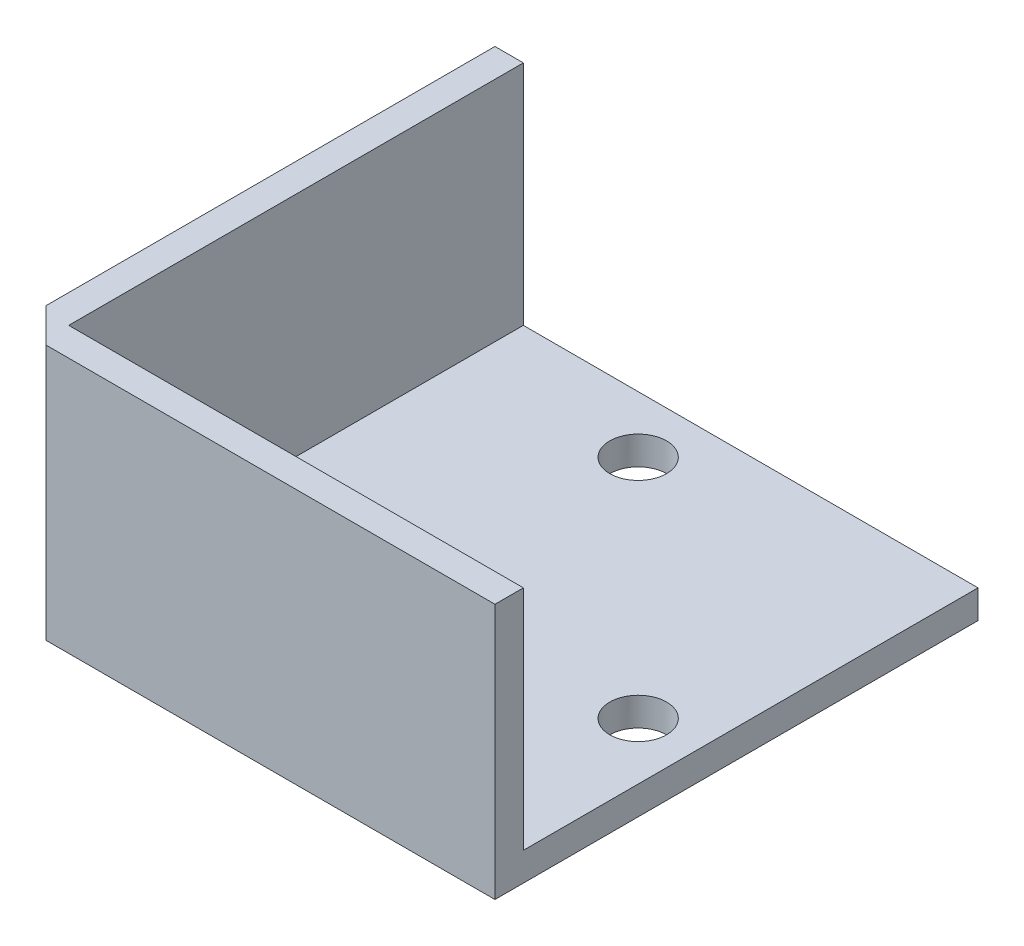
ISO-10303-21;
HEADER;
FILE_DESCRIPTION(('STEP AP214'),'2;1');
FILE_NAME('part.step','',(''),(''),'','','');
FILE_SCHEMA(('AUTOMOTIVE_DESIGN { 1 0 10303 214 1 1 1 1 }'));
ENDSEC;
DATA;
#1=APPLICATION_CONTEXT('core data for automotive mechanical design processes');
#2=APPLICATION_PROTOCOL_DEFINITION('international standard','automotive_design',2000,#1);
#3=PRODUCT_CONTEXT('',#1,'mechanical');
#4=PRODUCT('Part','Part','',(#3));
#5=PRODUCT_RELATED_PRODUCT_CATEGORY('part','',(#4));
#6=PRODUCT_DEFINITION_FORMATION('','',#4);
#7=PRODUCT_DEFINITION_CONTEXT('part definition',#1,'design');
#8=PRODUCT_DEFINITION('design','',#6,#7);
#9=PRODUCT_DEFINITION_SHAPE('','',#8);
#10=(LENGTH_UNIT() NAMED_UNIT(*) SI_UNIT(.MILLI.,.METRE.));
#11=(NAMED_UNIT(*) PLANE_ANGLE_UNIT() SI_UNIT($,.RADIAN.));
#12=(NAMED_UNIT(*) SI_UNIT($,.STERADIAN.) SOLID_ANGLE_UNIT());
#13=UNCERTAINTY_MEASURE_WITH_UNIT(LENGTH_MEASURE(1.E-05),#10,'distance_accuracy_value','');
#14=(GEOMETRIC_REPRESENTATION_CONTEXT(3) GLOBAL_UNCERTAINTY_ASSIGNED_CONTEXT((#13)) GLOBAL_UNIT_ASSIGNED_CONTEXT((#10,
#11,#12)) REPRESENTATION_CONTEXT('',''));
#15=CARTESIAN_POINT('',(0.,0.,0.));
#16=DIRECTION('',(0.,0.,1.));
#17=DIRECTION('',(1.,0.,0.));
#18=AXIS2_PLACEMENT_3D('',#15,#16,#17);
#19=CARTESIAN_POINT('',(0.,3.175,0.));
#20=DIRECTION('',(1.,0.,0.));
#21=DIRECTION('',(0.,0.,-1.));
#22=AXIS2_PLACEMENT_3D('',#19,#20,#21);
#23=PLANE('',#22);
#24=DIRECTION('',(0.,0.,1.));
#25=VECTOR('',#24,1.);
#26=CARTESIAN_POINT('',(0.,0.,0.));
#27=LINE('',#26,#25);
#28=CARTESIAN_POINT('',(0.,0.,-53.975));
#29=VERTEX_POINT('',#28);
#30=CARTESIAN_POINT('',(0.,0.,-3.81000000000001));
#31=VERTEX_POINT('',#30);
#32=EDGE_CURVE('E150',#29,#31,#27,.T.);
#33=ORIENTED_EDGE('',*,*,#32,.T.);
#34=DIRECTION('',(0.,1.,0.));
#35=VECTOR('',#34,1.);
#36=CARTESIAN_POINT('',(0.,3.175,-3.81000000000001));
#37=LINE('',#36,#35);
#38=CARTESIAN_POINT('',(0.,28.575,-3.81000000000001));
#39=VERTEX_POINT('',#38);
#40=EDGE_CURVE('E44',#31,#39,#37,.T.);
#41=ORIENTED_EDGE('',*,*,#40,.T.);
#42=DIRECTION('',(0.,0.,1.));
#43=VECTOR('',#42,1.);
#44=CARTESIAN_POINT('',(0.,28.575,0.));
#45=LINE('',#44,#43);
#46=CARTESIAN_POINT('',(0.,28.575,-53.975));
#47=VERTEX_POINT('',#46);
#48=EDGE_CURVE('E112',#47,#39,#45,.T.);
#49=ORIENTED_EDGE('',*,*,#48,.F.);
#50=DIRECTION('',(0.,-1.,0.));
#51=VECTOR('',#50,1.);
#52=CARTESIAN_POINT('',(0.,3.175,-53.975));
#53=LINE('',#52,#51);
#54=EDGE_CURVE('E157',#47,#29,#53,.T.);
#55=ORIENTED_EDGE('',*,*,#54,.T.);
#56=EDGE_LOOP('',(#33,#41,#49,#55));
#57=FACE_BOUND('',#56,.T.);
#58=ADVANCED_FACE('F35',(#57),#23,.F.);
#59=CARTESIAN_POINT('',(0.,3.175,0.));
#60=DIRECTION('',(0.,0.,-1.));
#61=DIRECTION('',(-1.,0.,0.));
#62=AXIS2_PLACEMENT_3D('',#59,#60,#61);
#63=PLANE('',#62);
#64=DIRECTION('',(1.,0.,0.));
#65=VECTOR('',#64,1.);
#66=CARTESIAN_POINT('',(0.,28.575,0.));
#67=LINE('',#66,#65);
#68=CARTESIAN_POINT('',(3.80999999999999,28.575,0.));
#69=VERTEX_POINT('',#68);
#70=CARTESIAN_POINT('',(53.975,28.575,0.));
#71=VERTEX_POINT('',#70);
#72=EDGE_CURVE('E101',#69,#71,#67,.T.);
#73=ORIENTED_EDGE('',*,*,#72,.F.);
#74=DIRECTION('',(0.,-1.,0.));
#75=VECTOR('',#74,1.);
#76=CARTESIAN_POINT('',(3.80999999999999,3.175,0.));
#77=LINE('',#76,#75);
#78=CARTESIAN_POINT('',(3.80999999999999,0.,0.));
#79=VERTEX_POINT('',#78);
#80=EDGE_CURVE('E120',#69,#79,#77,.T.);
#81=ORIENTED_EDGE('',*,*,#80,.T.);
#82=DIRECTION('',(1.,0.,0.));
#83=VECTOR('',#82,1.);
#84=CARTESIAN_POINT('',(0.,0.,0.));
#85=LINE('',#84,#83);
#86=CARTESIAN_POINT('',(53.975,0.,0.));
#87=VERTEX_POINT('',#86);
#88=EDGE_CURVE('E117',#79,#87,#85,.T.);
#89=ORIENTED_EDGE('',*,*,#88,.T.);
#90=DIRECTION('',(0.,-1.,0.));
#91=VECTOR('',#90,1.);
#92=CARTESIAN_POINT('',(53.975,3.175,0.));
#93=LINE('',#92,#91);
#94=EDGE_CURVE('E115',#71,#87,#93,.T.);
#95=ORIENTED_EDGE('',*,*,#94,.F.);
#96=EDGE_LOOP('',(#73,#81,#89,#95));
#97=FACE_BOUND('',#96,.T.);
#98=ADVANCED_FACE('F116',(#97),#63,.F.);
#99=CARTESIAN_POINT('',(53.975,3.175,0.));
#100=DIRECTION('',(-1.,0.,0.));
#101=DIRECTION('',(0.,0.,1.));
#102=AXIS2_PLACEMENT_3D('',#99,#100,#101);
#103=PLANE('',#102);
#104=DIRECTION('',(0.,0.,-1.));
#105=VECTOR('',#104,1.);
#106=CARTESIAN_POINT('',(53.975,0.,0.));
#107=LINE('',#106,#105);
#108=CARTESIAN_POINT('',(53.975,0.,-53.975));
#109=VERTEX_POINT('',#108);
#110=EDGE_CURVE('E160',#87,#109,#107,.T.);
#111=ORIENTED_EDGE('',*,*,#110,.T.);
#112=DIRECTION('',(0.,-1.,0.));
#113=VECTOR('',#112,1.);
#114=CARTESIAN_POINT('',(53.975,3.175,-53.975));
#115=LINE('',#114,#113);
#116=CARTESIAN_POINT('',(53.975,3.175,-53.975));
#117=VERTEX_POINT('',#116);
#118=EDGE_CURVE('E121',#117,#109,#115,.T.);
#119=ORIENTED_EDGE('',*,*,#118,.F.);
#120=DIRECTION('',(0.,0.,-1.));
#121=VECTOR('',#120,1.);
#122=CARTESIAN_POINT('',(53.975,3.175,0.));
#123=LINE('',#122,#121);
#124=CARTESIAN_POINT('',(53.975,3.175,-3.175));
#125=VERTEX_POINT('',#124);
#126=EDGE_CURVE('E151',#125,#117,#123,.T.);
#127=ORIENTED_EDGE('',*,*,#126,.F.);
#128=DIRECTION('',(0.,-1.,0.));
#129=VECTOR('',#128,1.);
#130=CARTESIAN_POINT('',(53.975,28.575,-3.175));
#131=LINE('',#130,#129);
#132=CARTESIAN_POINT('',(53.975,28.575,-3.175));
#133=VERTEX_POINT('',#132);
#134=EDGE_CURVE('E125',#133,#125,#131,.T.);
#135=ORIENTED_EDGE('',*,*,#134,.F.);
#136=DIRECTION('',(0.,0.,-1.));
#137=VECTOR('',#136,1.);
#138=CARTESIAN_POINT('',(53.975,28.575,0.));
#139=LINE('',#138,#137);
#140=EDGE_CURVE('E106',#71,#133,#139,.T.);
#141=ORIENTED_EDGE('',*,*,#140,.F.);
#142=ORIENTED_EDGE('',*,*,#94,.T.);
#143=EDGE_LOOP('',(#111,#119,#127,#135,#141,#142));
#144=FACE_BOUND('',#143,.T.);
#145=ADVANCED_FACE('F123',(#144),#103,.F.);
#146=CARTESIAN_POINT('',(0.,3.175,-53.975));
#147=DIRECTION('',(0.,0.,1.));
#148=DIRECTION('',(1.,0.,0.));
#149=AXIS2_PLACEMENT_3D('',#146,#147,#148);
#150=PLANE('',#149);
#151=DIRECTION('',(-1.,0.,0.));
#152=VECTOR('',#151,1.);
#153=CARTESIAN_POINT('',(0.,0.,-53.975));
#154=LINE('',#153,#152);
#155=EDGE_CURVE('E154',#109,#29,#154,.T.);
#156=ORIENTED_EDGE('',*,*,#155,.T.);
#157=ORIENTED_EDGE('',*,*,#54,.F.);
#158=DIRECTION('',(-1.,0.,0.));
#159=VECTOR('',#158,1.);
#160=CARTESIAN_POINT('',(0.,28.575,-53.975));
#161=LINE('',#160,#159);
#162=CARTESIAN_POINT('',(3.175,28.575,-53.975));
#163=VERTEX_POINT('',#162);
#164=EDGE_CURVE('E135',#163,#47,#161,.T.);
#165=ORIENTED_EDGE('',*,*,#164,.F.);
#166=DIRECTION('',(0.,-1.,0.));
#167=VECTOR('',#166,1.);
#168=CARTESIAN_POINT('',(3.175,28.575,-53.975));
#169=LINE('',#168,#167);
#170=CARTESIAN_POINT('',(3.175,3.175,-53.975));
#171=VERTEX_POINT('',#170);
#172=EDGE_CURVE('E138',#163,#171,#169,.T.);
#173=ORIENTED_EDGE('',*,*,#172,.T.);
#174=DIRECTION('',(-1.,0.,0.));
#175=VECTOR('',#174,1.);
#176=CARTESIAN_POINT('',(0.,3.175,-53.975));
#177=LINE('',#176,#175);
#178=EDGE_CURVE('E153',#117,#171,#177,.T.);
#179=ORIENTED_EDGE('',*,*,#178,.F.);
#180=ORIENTED_EDGE('',*,*,#118,.T.);
#181=EDGE_LOOP('',(#156,#157,#165,#173,#179,#180));
#182=FACE_BOUND('',#181,.T.);
#183=ADVANCED_FACE('F188',(#182),#150,.F.);
#184=CARTESIAN_POINT('',(0.,3.175,0.));
#185=DIRECTION('',(0.,-1.,0.));
#186=DIRECTION('',(0.,0.,-1.));
#187=AXIS2_PLACEMENT_3D('',#184,#185,#186);
#188=PLANE('',#187);
#189=CARTESIAN_POINT('',(47.625,3.175,-22.352));
#190=DIRECTION('',(0.,1.,0.));
#191=DIRECTION('',(0.,0.,1.));
#192=AXIS2_PLACEMENT_3D('',#189,#190,#191);
#193=CIRCLE('',#192,3.175);
#194=CARTESIAN_POINT('',(47.625,3.175,-19.177));
#195=VERTEX_POINT('',#194);
#196=EDGE_CURVE('E178',#195,#195,#193,.T.);
#197=ORIENTED_EDGE('',*,*,#196,.F.);
#198=EDGE_LOOP('',(#197));
#199=FACE_BOUND('',#198,.T.);
#200=CARTESIAN_POINT('',(22.352,3.175,-47.625));
#201=DIRECTION('',(0.,1.,0.));
#202=DIRECTION('',(0.,0.,1.));
#203=AXIS2_PLACEMENT_3D('',#200,#201,#202);
#204=CIRCLE('',#203,3.175);
#205=CARTESIAN_POINT('',(22.352,3.175,-44.45));
#206=VERTEX_POINT('',#205);
#207=EDGE_CURVE('E170',#206,#206,#204,.T.);
#208=ORIENTED_EDGE('',*,*,#207,.F.);
#209=EDGE_LOOP('',(#208));
#210=FACE_BOUND('',#209,.T.);
#211=ORIENTED_EDGE('',*,*,#178,.T.);
#212=DIRECTION('',(0.,0.,1.));
#213=VECTOR('',#212,1.);
#214=CARTESIAN_POINT('',(3.17500000000001,3.175,0.));
#215=LINE('',#214,#213);
#216=CARTESIAN_POINT('',(3.17500000000001,3.175,-3.175));
#217=VERTEX_POINT('',#216);
#218=EDGE_CURVE('E142',#171,#217,#215,.T.);
#219=ORIENTED_EDGE('',*,*,#218,.T.);
#220=DIRECTION('',(1.,0.,0.));
#221=VECTOR('',#220,1.);
#222=CARTESIAN_POINT('',(0.,3.175,-3.175));
#223=LINE('',#222,#221);
#224=EDGE_CURVE('E139',#217,#125,#223,.T.);
#225=ORIENTED_EDGE('',*,*,#224,.T.);
#226=ORIENTED_EDGE('',*,*,#126,.T.);
#227=EDGE_LOOP('',(#211,#219,#225,#226));
#228=FACE_BOUND('',#227,.T.);
#229=ADVANCED_FACE('F191',(#199,#210,#228),#188,.F.);
#230=CARTESIAN_POINT('',(0.,0.,0.));
#231=DIRECTION('',(0.,-1.,0.));
#232=DIRECTION('',(0.,0.,-1.));
#233=AXIS2_PLACEMENT_3D('',#230,#231,#232);
#234=PLANE('',#233);
#235=CARTESIAN_POINT('',(47.625,0.,-22.352));
#236=DIRECTION('',(0.,-1.,0.));
#237=DIRECTION('',(0.,0.,-1.));
#238=AXIS2_PLACEMENT_3D('',#235,#236,#237);
#239=CIRCLE('',#238,3.175);
#240=CARTESIAN_POINT('',(47.625,0.,-25.527));
#241=VERTEX_POINT('',#240);
#242=EDGE_CURVE('E39',#241,#241,#239,.T.);
#243=ORIENTED_EDGE('',*,*,#242,.F.);
#244=EDGE_LOOP('',(#243));
#245=FACE_BOUND('',#244,.T.);
#246=CARTESIAN_POINT('',(22.352,0.,-47.625));
#247=DIRECTION('',(0.,-1.,0.));
#248=DIRECTION('',(0.,0.,-1.));
#249=AXIS2_PLACEMENT_3D('',#246,#247,#248);
#250=CIRCLE('',#249,3.175);
#251=CARTESIAN_POINT('',(22.352,0.,-50.8));
#252=VERTEX_POINT('',#251);
#253=EDGE_CURVE('E143',#252,#252,#250,.T.);
#254=ORIENTED_EDGE('',*,*,#253,.F.);
#255=EDGE_LOOP('',(#254));
#256=FACE_BOUND('',#255,.T.);
#257=ORIENTED_EDGE('',*,*,#88,.F.);
#258=DIRECTION('',(0.707106781186546,0.,0.707106781186549));
#259=VECTOR('',#258,1.);
#260=CARTESIAN_POINT('',(1.905,0.,-1.905));
#261=LINE('',#260,#259);
#262=EDGE_CURVE('E59',#79,#31,#261,.F.);
#263=ORIENTED_EDGE('',*,*,#262,.T.);
#264=ORIENTED_EDGE('',*,*,#32,.F.);
#265=ORIENTED_EDGE('',*,*,#155,.F.);
#266=ORIENTED_EDGE('',*,*,#110,.F.);
#267=EDGE_LOOP('',(#257,#263,#264,#265,#266));
#268=FACE_BOUND('',#267,.T.);
#269=ADVANCED_FACE('F183',(#245,#256,#268),#234,.T.);
#270=CARTESIAN_POINT('',(0.,28.575,-3.175));
#271=DIRECTION('',(0.,0.,-1.));
#272=DIRECTION('',(-1.,0.,0.));
#273=AXIS2_PLACEMENT_3D('',#270,#271,#272);
#274=PLANE('',#273);
#275=ORIENTED_EDGE('',*,*,#224,.F.);
#276=DIRECTION('',(0.,-1.,0.));
#277=VECTOR('',#276,1.);
#278=CARTESIAN_POINT('',(3.17500000000001,28.575,-3.175));
#279=LINE('',#278,#277);
#280=CARTESIAN_POINT('',(3.17500000000001,28.575,-3.175));
#281=VERTEX_POINT('',#280);
#282=EDGE_CURVE('E147',#281,#217,#279,.T.);
#283=ORIENTED_EDGE('',*,*,#282,.F.);
#284=DIRECTION('',(1.,0.,0.));
#285=VECTOR('',#284,1.);
#286=CARTESIAN_POINT('',(0.,28.575,-3.175));
#287=LINE('',#286,#285);
#288=EDGE_CURVE('E127',#281,#133,#287,.T.);
#289=ORIENTED_EDGE('',*,*,#288,.T.);
#290=ORIENTED_EDGE('',*,*,#134,.T.);
#291=EDGE_LOOP('',(#275,#283,#289,#290));
#292=FACE_BOUND('',#291,.T.);
#293=ADVANCED_FACE('F194',(#292),#274,.T.);
#294=CARTESIAN_POINT('',(3.17500000000001,28.575,0.));
#295=DIRECTION('',(1.,0.,0.));
#296=DIRECTION('',(0.,0.,-1.));
#297=AXIS2_PLACEMENT_3D('',#294,#295,#296);
#298=PLANE('',#297);
#299=ORIENTED_EDGE('',*,*,#218,.F.);
#300=ORIENTED_EDGE('',*,*,#172,.F.);
#301=DIRECTION('',(0.,0.,1.));
#302=VECTOR('',#301,1.);
#303=CARTESIAN_POINT('',(3.17500000000001,28.575,0.));
#304=LINE('',#303,#302);
#305=EDGE_CURVE('E129',#163,#281,#304,.T.);
#306=ORIENTED_EDGE('',*,*,#305,.T.);
#307=ORIENTED_EDGE('',*,*,#282,.T.);
#308=EDGE_LOOP('',(#299,#300,#306,#307));
#309=FACE_BOUND('',#308,.T.);
#310=ADVANCED_FACE('F196',(#309),#298,.T.);
#311=CARTESIAN_POINT('',(0.,28.575,0.));
#312=DIRECTION('',(0.,1.,0.));
#313=DIRECTION('',(0.,0.,1.));
#314=AXIS2_PLACEMENT_3D('',#311,#312,#313);
#315=PLANE('',#314);
#316=ORIENTED_EDGE('',*,*,#48,.T.);
#317=DIRECTION('',(-0.707106781186546,0.,-0.707106781186549));
#318=VECTOR('',#317,1.);
#319=CARTESIAN_POINT('',(1.905,28.575,-1.905));
#320=LINE('',#319,#318);
#321=EDGE_CURVE('E11',#39,#69,#320,.F.);
#322=ORIENTED_EDGE('',*,*,#321,.T.);
#323=ORIENTED_EDGE('',*,*,#72,.T.);
#324=ORIENTED_EDGE('',*,*,#140,.T.);
#325=ORIENTED_EDGE('',*,*,#288,.F.);
#326=ORIENTED_EDGE('',*,*,#305,.F.);
#327=ORIENTED_EDGE('',*,*,#164,.T.);
#328=EDGE_LOOP('',(#316,#322,#323,#324,#325,#326,#327));
#329=FACE_BOUND('',#328,.T.);
#330=ADVANCED_FACE('F103',(#329),#315,.T.);
#331=CARTESIAN_POINT('',(3.80999999999999,3.175,0.));
#332=DIRECTION('',(0.707106781186549,0.,-0.707106781186546));
#333=DIRECTION('',(0.,-1.,0.));
#334=AXIS2_PLACEMENT_3D('',#331,#332,#333);
#335=PLANE('',#334);
#336=ORIENTED_EDGE('',*,*,#321,.F.);
#337=ORIENTED_EDGE('',*,*,#40,.F.);
#338=ORIENTED_EDGE('',*,*,#262,.F.);
#339=ORIENTED_EDGE('',*,*,#80,.F.);
#340=EDGE_LOOP('',(#336,#337,#338,#339));
#341=FACE_BOUND('',#340,.T.);
#342=ADVANCED_FACE('F37',(#341),#335,.F.);
#343=CARTESIAN_POINT('',(22.352,-22.225,-47.625));
#344=DIRECTION('',(0.,1.,0.));
#345=DIRECTION('',(0.,0.,1.));
#346=AXIS2_PLACEMENT_3D('',#343,#344,#345);
#347=CYLINDRICAL_SURFACE('',#346,3.175);
#348=ORIENTED_EDGE('',*,*,#253,.T.);
#349=EDGE_LOOP('',(#348));
#350=FACE_BOUND('',#349,.T.);
#351=ORIENTED_EDGE('',*,*,#207,.T.);
#352=EDGE_LOOP('',(#351));
#353=FACE_BOUND('',#352,.T.);
#354=ADVANCED_FACE('F219',(#350,#353),#347,.F.);
#355=CARTESIAN_POINT('',(47.625,-22.225,-22.352));
#356=DIRECTION('',(0.,1.,0.));
#357=DIRECTION('',(0.,0.,1.));
#358=AXIS2_PLACEMENT_3D('',#355,#356,#357);
#359=CYLINDRICAL_SURFACE('',#358,3.175);
#360=ORIENTED_EDGE('',*,*,#242,.T.);
#361=EDGE_LOOP('',(#360));
#362=FACE_BOUND('',#361,.T.);
#363=ORIENTED_EDGE('',*,*,#196,.T.);
#364=EDGE_LOOP('',(#363));
#365=FACE_BOUND('',#364,.T.);
#366=ADVANCED_FACE('F222',(#362,#365),#359,.F.);
#367=CLOSED_SHELL('',(#58,#98,#145,#183,#229,#269,#293,#310,#330,#342,#354,#366));
#368=MANIFOLD_SOLID_BREP('B2',#367);
#369=ADVANCED_BREP_SHAPE_REPRESENTATION('',(#18,#368),#14);
#370=SHAPE_DEFINITION_REPRESENTATION(#9,#369);
ENDSEC;
END-ISO-10303-21;
